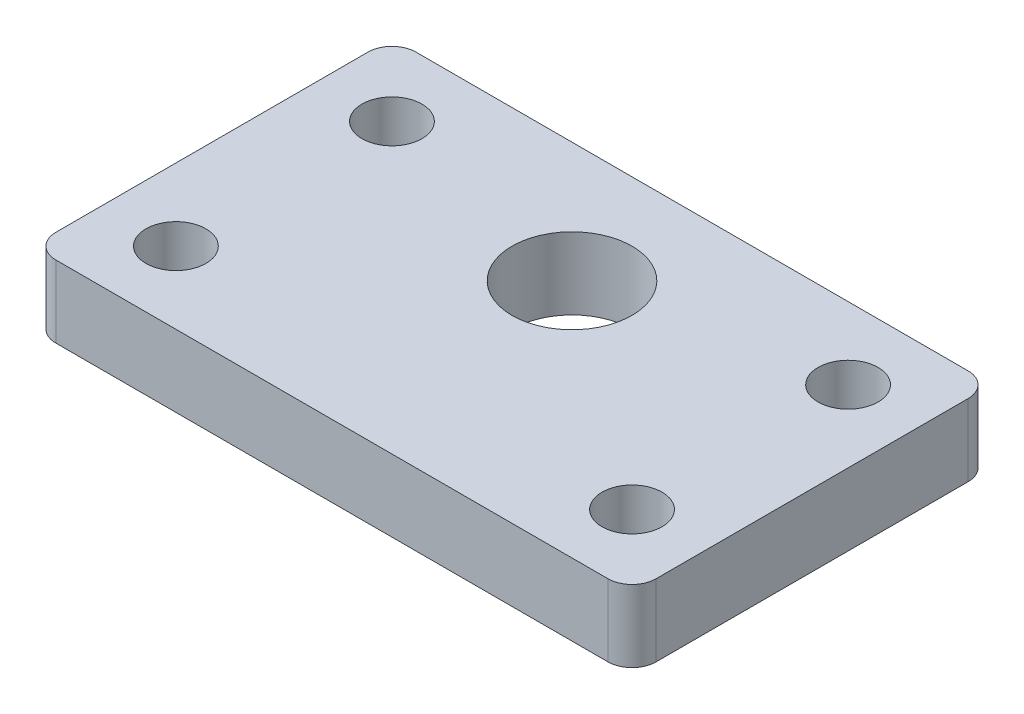
ISO-10303-21;
HEADER;
FILE_DESCRIPTION(('STEP AP214'),'2;1');
FILE_NAME('part.step','',(''),(''),'','','');
FILE_SCHEMA(('AUTOMOTIVE_DESIGN { 1 0 10303 214 1 1 1 1 }'));
ENDSEC;
DATA;
#1=APPLICATION_CONTEXT('core data for automotive mechanical design processes');
#2=APPLICATION_PROTOCOL_DEFINITION('international standard','automotive_design',2000,#1);
#3=PRODUCT_CONTEXT('',#1,'mechanical');
#4=PRODUCT('Part','Part','',(#3));
#5=PRODUCT_RELATED_PRODUCT_CATEGORY('part','',(#4));
#6=PRODUCT_DEFINITION_FORMATION('','',#4);
#7=PRODUCT_DEFINITION_CONTEXT('part definition',#1,'design');
#8=PRODUCT_DEFINITION('design','',#6,#7);
#9=PRODUCT_DEFINITION_SHAPE('','',#8);
#10=(LENGTH_UNIT() NAMED_UNIT(*) SI_UNIT(.MILLI.,.METRE.));
#11=(NAMED_UNIT(*) PLANE_ANGLE_UNIT() SI_UNIT($,.RADIAN.));
#12=(NAMED_UNIT(*) SI_UNIT($,.STERADIAN.) SOLID_ANGLE_UNIT());
#13=UNCERTAINTY_MEASURE_WITH_UNIT(LENGTH_MEASURE(1.E-05),#10,'distance_accuracy_value','');
#14=(GEOMETRIC_REPRESENTATION_CONTEXT(3) GLOBAL_UNCERTAINTY_ASSIGNED_CONTEXT((#13)) GLOBAL_UNIT_ASSIGNED_CONTEXT((#10,
#11,#12)) REPRESENTATION_CONTEXT('',''));
#15=CARTESIAN_POINT('',(0.,0.,0.));
#16=DIRECTION('',(0.,0.,1.));
#17=DIRECTION('',(1.,0.,0.));
#18=AXIS2_PLACEMENT_3D('',#15,#16,#17);
#19=CARTESIAN_POINT('',(115.,30.,-65.));
#20=DIRECTION('',(0.,-1.,0.));
#21=DIRECTION('',(0.,0.,-1.));
#22=AXIS2_PLACEMENT_3D('',#19,#20,#21);
#23=CYLINDRICAL_SURFACE('',#22,9.99999999999999);
#24=CARTESIAN_POINT('',(115.,0.,-65.));
#25=DIRECTION('',(0.,1.,0.));
#26=DIRECTION('',(0.,0.,-1.));
#27=AXIS2_PLACEMENT_3D('',#24,#25,#26);
#28=CIRCLE('',#27,9.99999999999999);
#29=CARTESIAN_POINT('',(125.,0.,-64.9999999999999));
#30=VERTEX_POINT('',#29);
#31=CARTESIAN_POINT('',(115.,0.,-75.));
#32=VERTEX_POINT('',#31);
#33=EDGE_CURVE('E146',#30,#32,#28,.T.);
#34=ORIENTED_EDGE('',*,*,#33,.T.);
#35=DIRECTION('',(0.,-1.,0.));
#36=VECTOR('',#35,1.);
#37=CARTESIAN_POINT('',(115.,30.,-75.));
#38=LINE('',#37,#36);
#39=CARTESIAN_POINT('',(115.,30.,-75.));
#40=VERTEX_POINT('',#39);
#41=EDGE_CURVE('E11',#40,#32,#38,.T.);
#42=ORIENTED_EDGE('',*,*,#41,.F.);
#43=CARTESIAN_POINT('',(115.,30.,-65.));
#44=DIRECTION('',(0.,1.,0.));
#45=DIRECTION('',(0.,0.,-1.));
#46=AXIS2_PLACEMENT_3D('',#43,#44,#45);
#47=CIRCLE('',#46,9.99999999999999);
#48=CARTESIAN_POINT('',(125.,30.,-64.9999999999999));
#49=VERTEX_POINT('',#48);
#50=EDGE_CURVE('E169',#49,#40,#47,.T.);
#51=ORIENTED_EDGE('',*,*,#50,.F.);
#52=DIRECTION('',(0.,-1.,0.));
#53=VECTOR('',#52,1.);
#54=CARTESIAN_POINT('',(125.,30.,-64.9999999999999));
#55=LINE('',#54,#53);
#56=EDGE_CURVE('E142',#49,#30,#55,.T.);
#57=ORIENTED_EDGE('',*,*,#56,.T.);
#58=EDGE_LOOP('',(#34,#42,#51,#57));
#59=FACE_BOUND('',#58,.T.);
#60=ADVANCED_FACE('F45',(#59),#23,.T.);
#61=CARTESIAN_POINT('',(-115.,30.,-75.));
#62=DIRECTION('',(0.,0.,1.));
#63=DIRECTION('',(1.,0.,0.));
#64=AXIS2_PLACEMENT_3D('',#61,#62,#63);
#65=PLANE('',#64);
#66=DIRECTION('',(-1.,0.,0.));
#67=VECTOR('',#66,1.);
#68=CARTESIAN_POINT('',(-115.,0.,-75.));
#69=LINE('',#68,#67);
#70=CARTESIAN_POINT('',(-115.,0.,-75.));
#71=VERTEX_POINT('',#70);
#72=EDGE_CURVE('E150',#32,#71,#69,.T.);
#73=ORIENTED_EDGE('',*,*,#72,.T.);
#74=DIRECTION('',(0.,-1.,0.));
#75=VECTOR('',#74,1.);
#76=CARTESIAN_POINT('',(-115.,30.,-75.));
#77=LINE('',#76,#75);
#78=CARTESIAN_POINT('',(-115.,30.,-75.));
#79=VERTEX_POINT('',#78);
#80=EDGE_CURVE('E54',#79,#71,#77,.T.);
#81=ORIENTED_EDGE('',*,*,#80,.F.);
#82=DIRECTION('',(-1.,0.,0.));
#83=VECTOR('',#82,1.);
#84=CARTESIAN_POINT('',(-115.,30.,-75.));
#85=LINE('',#84,#83);
#86=EDGE_CURVE('E105',#40,#79,#85,.T.);
#87=ORIENTED_EDGE('',*,*,#86,.F.);
#88=ORIENTED_EDGE('',*,*,#41,.T.);
#89=EDGE_LOOP('',(#73,#81,#87,#88));
#90=FACE_BOUND('',#89,.T.);
#91=ADVANCED_FACE('F278',(#90),#65,.F.);
#92=CARTESIAN_POINT('',(-115.,30.,-65.));
#93=DIRECTION('',(0.,-1.,0.));
#94=DIRECTION('',(0.,0.,-1.));
#95=AXIS2_PLACEMENT_3D('',#92,#93,#94);
#96=CYLINDRICAL_SURFACE('',#95,9.99999999999999);
#97=CARTESIAN_POINT('',(-115.,0.,-65.));
#98=DIRECTION('',(0.,1.,0.));
#99=DIRECTION('',(0.,0.,1.));
#100=AXIS2_PLACEMENT_3D('',#97,#98,#99);
#101=CIRCLE('',#100,9.99999999999999);
#102=CARTESIAN_POINT('',(-125.,0.,-64.9999999999999));
#103=VERTEX_POINT('',#102);
#104=EDGE_CURVE('E154',#71,#103,#101,.T.);
#105=ORIENTED_EDGE('',*,*,#104,.T.);
#106=DIRECTION('',(0.,-1.,0.));
#107=VECTOR('',#106,1.);
#108=CARTESIAN_POINT('',(-125.,30.,-64.9999999999999));
#109=LINE('',#108,#107);
#110=CARTESIAN_POINT('',(-125.,30.,-64.9999999999999));
#111=VERTEX_POINT('',#110);
#112=EDGE_CURVE('E180',#111,#103,#109,.T.);
#113=ORIENTED_EDGE('',*,*,#112,.F.);
#114=CARTESIAN_POINT('',(-115.,30.,-65.));
#115=DIRECTION('',(0.,1.,0.));
#116=DIRECTION('',(0.,0.,1.));
#117=AXIS2_PLACEMENT_3D('',#114,#115,#116);
#118=CIRCLE('',#117,9.99999999999999);
#119=EDGE_CURVE('E190',#79,#111,#118,.T.);
#120=ORIENTED_EDGE('',*,*,#119,.F.);
#121=ORIENTED_EDGE('',*,*,#80,.T.);
#122=EDGE_LOOP('',(#105,#113,#120,#121));
#123=FACE_BOUND('',#122,.T.);
#124=ADVANCED_FACE('F188',(#123),#96,.T.);
#125=CARTESIAN_POINT('',(-125.,30.,-64.9999999999999));
#126=DIRECTION('',(1.,0.,0.));
#127=DIRECTION('',(0.,0.,-1.));
#128=AXIS2_PLACEMENT_3D('',#125,#126,#127);
#129=PLANE('',#128);
#130=DIRECTION('',(0.,0.,1.));
#131=VECTOR('',#130,1.);
#132=CARTESIAN_POINT('',(-125.,0.,-64.9999999999999));
#133=LINE('',#132,#131);
#134=CARTESIAN_POINT('',(-125.,0.,64.9999999999999));
#135=VERTEX_POINT('',#134);
#136=EDGE_CURVE('E157',#103,#135,#133,.T.);
#137=ORIENTED_EDGE('',*,*,#136,.T.);
#138=DIRECTION('',(0.,-1.,0.));
#139=VECTOR('',#138,1.);
#140=CARTESIAN_POINT('',(-125.,30.,64.9999999999999));
#141=LINE('',#140,#139);
#142=CARTESIAN_POINT('',(-125.,30.,64.9999999999999));
#143=VERTEX_POINT('',#142);
#144=EDGE_CURVE('E176',#143,#135,#141,.T.);
#145=ORIENTED_EDGE('',*,*,#144,.F.);
#146=DIRECTION('',(0.,0.,1.));
#147=VECTOR('',#146,1.);
#148=CARTESIAN_POINT('',(-125.,30.,-64.9999999999999));
#149=LINE('',#148,#147);
#150=EDGE_CURVE('E203',#111,#143,#149,.T.);
#151=ORIENTED_EDGE('',*,*,#150,.F.);
#152=ORIENTED_EDGE('',*,*,#112,.T.);
#153=EDGE_LOOP('',(#137,#145,#151,#152));
#154=FACE_BOUND('',#153,.T.);
#155=ADVANCED_FACE('F198',(#154),#129,.F.);
#156=CARTESIAN_POINT('',(-115.,30.,65.));
#157=DIRECTION('',(0.,-1.,0.));
#158=DIRECTION('',(0.,0.,-1.));
#159=AXIS2_PLACEMENT_3D('',#156,#157,#158);
#160=CYLINDRICAL_SURFACE('',#159,9.99999999999999);
#161=CARTESIAN_POINT('',(-115.,0.,65.));
#162=DIRECTION('',(0.,1.,0.));
#163=DIRECTION('',(0.,0.,1.));
#164=AXIS2_PLACEMENT_3D('',#161,#162,#163);
#165=CIRCLE('',#164,9.99999999999999);
#166=CARTESIAN_POINT('',(-115.,0.,75.));
#167=VERTEX_POINT('',#166);
#168=EDGE_CURVE('E160',#135,#167,#165,.T.);
#169=ORIENTED_EDGE('',*,*,#168,.T.);
#170=DIRECTION('',(0.,-1.,0.));
#171=VECTOR('',#170,1.);
#172=CARTESIAN_POINT('',(-115.,30.,75.));
#173=LINE('',#172,#171);
#174=CARTESIAN_POINT('',(-115.,30.,75.));
#175=VERTEX_POINT('',#174);
#176=EDGE_CURVE('E135',#175,#167,#173,.T.);
#177=ORIENTED_EDGE('',*,*,#176,.F.);
#178=CARTESIAN_POINT('',(-115.,30.,65.));
#179=DIRECTION('',(0.,1.,0.));
#180=DIRECTION('',(0.,0.,1.));
#181=AXIS2_PLACEMENT_3D('',#178,#179,#180);
#182=CIRCLE('',#181,9.99999999999999);
#183=EDGE_CURVE('E124',#143,#175,#182,.T.);
#184=ORIENTED_EDGE('',*,*,#183,.F.);
#185=ORIENTED_EDGE('',*,*,#144,.T.);
#186=EDGE_LOOP('',(#169,#177,#184,#185));
#187=FACE_BOUND('',#186,.T.);
#188=ADVANCED_FACE('F201',(#187),#160,.T.);
#189=CARTESIAN_POINT('',(-115.,30.,75.));
#190=DIRECTION('',(0.,0.,-1.));
#191=DIRECTION('',(-1.,0.,0.));
#192=AXIS2_PLACEMENT_3D('',#189,#190,#191);
#193=PLANE('',#192);
#194=DIRECTION('',(1.,0.,0.));
#195=VECTOR('',#194,1.);
#196=CARTESIAN_POINT('',(-115.,0.,75.));
#197=LINE('',#196,#195);
#198=CARTESIAN_POINT('',(115.,0.,75.));
#199=VERTEX_POINT('',#198);
#200=EDGE_CURVE('E133',#167,#199,#197,.T.);
#201=ORIENTED_EDGE('',*,*,#200,.T.);
#202=DIRECTION('',(0.,-1.,0.));
#203=VECTOR('',#202,1.);
#204=CARTESIAN_POINT('',(115.,30.,75.));
#205=LINE('',#204,#203);
#206=CARTESIAN_POINT('',(115.,30.,75.));
#207=VERTEX_POINT('',#206);
#208=EDGE_CURVE('E130',#207,#199,#205,.T.);
#209=ORIENTED_EDGE('',*,*,#208,.F.);
#210=DIRECTION('',(1.,0.,0.));
#211=VECTOR('',#210,1.);
#212=CARTESIAN_POINT('',(-115.,30.,75.));
#213=LINE('',#212,#211);
#214=EDGE_CURVE('E118',#175,#207,#213,.T.);
#215=ORIENTED_EDGE('',*,*,#214,.F.);
#216=ORIENTED_EDGE('',*,*,#176,.T.);
#217=EDGE_LOOP('',(#201,#209,#215,#216));
#218=FACE_BOUND('',#217,.T.);
#219=ADVANCED_FACE('F131',(#218),#193,.F.);
#220=CARTESIAN_POINT('',(115.,30.,65.));
#221=DIRECTION('',(0.,-1.,0.));
#222=DIRECTION('',(0.,0.,-1.));
#223=AXIS2_PLACEMENT_3D('',#220,#221,#222);
#224=CYLINDRICAL_SURFACE('',#223,10.);
#225=CARTESIAN_POINT('',(115.,0.,65.));
#226=DIRECTION('',(0.,1.,0.));
#227=DIRECTION('',(0.,0.,1.));
#228=AXIS2_PLACEMENT_3D('',#225,#226,#227);
#229=CIRCLE('',#228,10.);
#230=CARTESIAN_POINT('',(125.,0.,64.9999999999999));
#231=VERTEX_POINT('',#230);
#232=EDGE_CURVE('E91',#199,#231,#229,.T.);
#233=ORIENTED_EDGE('',*,*,#232,.T.);
#234=DIRECTION('',(0.,-1.,0.));
#235=VECTOR('',#234,1.);
#236=CARTESIAN_POINT('',(125.,30.,64.9999999999999));
#237=LINE('',#236,#235);
#238=CARTESIAN_POINT('',(125.,30.,64.9999999999999));
#239=VERTEX_POINT('',#238);
#240=EDGE_CURVE('E136',#239,#231,#237,.T.);
#241=ORIENTED_EDGE('',*,*,#240,.F.);
#242=CARTESIAN_POINT('',(115.,30.,65.));
#243=DIRECTION('',(0.,1.,0.));
#244=DIRECTION('',(0.,0.,1.));
#245=AXIS2_PLACEMENT_3D('',#242,#243,#244);
#246=CIRCLE('',#245,10.);
#247=EDGE_CURVE('E122',#207,#239,#246,.T.);
#248=ORIENTED_EDGE('',*,*,#247,.F.);
#249=ORIENTED_EDGE('',*,*,#208,.T.);
#250=EDGE_LOOP('',(#233,#241,#248,#249));
#251=FACE_BOUND('',#250,.T.);
#252=ADVANCED_FACE('F138',(#251),#224,.T.);
#253=CARTESIAN_POINT('',(125.,30.,-64.9999999999999));
#254=DIRECTION('',(-1.,0.,0.));
#255=DIRECTION('',(0.,0.,1.));
#256=AXIS2_PLACEMENT_3D('',#253,#254,#255);
#257=PLANE('',#256);
#258=DIRECTION('',(0.,0.,-1.));
#259=VECTOR('',#258,1.);
#260=CARTESIAN_POINT('',(125.,0.,-64.9999999999999));
#261=LINE('',#260,#259);
#262=EDGE_CURVE('E97',#231,#30,#261,.T.);
#263=ORIENTED_EDGE('',*,*,#262,.T.);
#264=ORIENTED_EDGE('',*,*,#56,.F.);
#265=DIRECTION('',(0.,0.,-1.));
#266=VECTOR('',#265,1.);
#267=CARTESIAN_POINT('',(125.,30.,-64.9999999999999));
#268=LINE('',#267,#266);
#269=EDGE_CURVE('E62',#239,#49,#268,.T.);
#270=ORIENTED_EDGE('',*,*,#269,.F.);
#271=ORIENTED_EDGE('',*,*,#240,.T.);
#272=EDGE_LOOP('',(#263,#264,#270,#271));
#273=FACE_BOUND('',#272,.T.);
#274=ADVANCED_FACE('F257',(#273),#257,.F.);
#275=CARTESIAN_POINT('',(115.,30.,-65.));
#276=DIRECTION('',(0.,-1.,0.));
#277=DIRECTION('',(0.,0.,-1.));
#278=AXIS2_PLACEMENT_3D('',#275,#276,#277);
#279=PLANE('',#278);
#280=CARTESIAN_POINT('',(-95.,30.,45.));
#281=DIRECTION('',(0.,1.,0.));
#282=DIRECTION('',(0.,0.,1.));
#283=AXIS2_PLACEMENT_3D('',#280,#281,#282);
#284=CIRCLE('',#283,12.5);
#285=CARTESIAN_POINT('',(-95.,30.,57.5));
#286=VERTEX_POINT('',#285);
#287=EDGE_CURVE('E225',#286,#286,#284,.T.);
#288=ORIENTED_EDGE('',*,*,#287,.F.);
#289=EDGE_LOOP('',(#288));
#290=FACE_BOUND('',#289,.T.);
#291=CARTESIAN_POINT('',(95.,30.,45.));
#292=DIRECTION('',(0.,1.,0.));
#293=DIRECTION('',(0.,0.,1.));
#294=AXIS2_PLACEMENT_3D('',#291,#292,#293);
#295=CIRCLE('',#294,12.5);
#296=CARTESIAN_POINT('',(95.,30.,57.5));
#297=VERTEX_POINT('',#296);
#298=EDGE_CURVE('E233',#297,#297,#295,.T.);
#299=ORIENTED_EDGE('',*,*,#298,.F.);
#300=EDGE_LOOP('',(#299));
#301=FACE_BOUND('',#300,.T.);
#302=CARTESIAN_POINT('',(95.,30.,-45.));
#303=DIRECTION('',(0.,1.,0.));
#304=DIRECTION('',(0.,0.,1.));
#305=AXIS2_PLACEMENT_3D('',#302,#303,#304);
#306=CIRCLE('',#305,12.5);
#307=CARTESIAN_POINT('',(95.,30.,-32.5));
#308=VERTEX_POINT('',#307);
#309=EDGE_CURVE('E241',#308,#308,#306,.T.);
#310=ORIENTED_EDGE('',*,*,#309,.F.);
#311=EDGE_LOOP('',(#310));
#312=FACE_BOUND('',#311,.T.);
#313=CARTESIAN_POINT('',(-95.,30.,-45.));
#314=DIRECTION('',(0.,1.,0.));
#315=DIRECTION('',(0.,0.,1.));
#316=AXIS2_PLACEMENT_3D('',#313,#314,#315);
#317=CIRCLE('',#316,12.5);
#318=CARTESIAN_POINT('',(-95.,30.,-32.5));
#319=VERTEX_POINT('',#318);
#320=EDGE_CURVE('E217',#319,#319,#317,.T.);
#321=ORIENTED_EDGE('',*,*,#320,.F.);
#322=EDGE_LOOP('',(#321));
#323=FACE_BOUND('',#322,.T.);
#324=CARTESIAN_POINT('',(0.,30.,-25.));
#325=DIRECTION('',(0.,1.,0.));
#326=DIRECTION('',(0.,0.,1.));
#327=AXIS2_PLACEMENT_3D('',#324,#325,#326);
#328=CIRCLE('',#327,25.);
#329=CARTESIAN_POINT('',(0.,30.,0.));
#330=VERTEX_POINT('',#329);
#331=EDGE_CURVE('E213',#330,#330,#328,.T.);
#332=ORIENTED_EDGE('',*,*,#331,.F.);
#333=EDGE_LOOP('',(#332));
#334=FACE_BOUND('',#333,.T.);
#335=ORIENTED_EDGE('',*,*,#50,.T.);
#336=ORIENTED_EDGE('',*,*,#86,.T.);
#337=ORIENTED_EDGE('',*,*,#119,.T.);
#338=ORIENTED_EDGE('',*,*,#150,.T.);
#339=ORIENTED_EDGE('',*,*,#183,.T.);
#340=ORIENTED_EDGE('',*,*,#214,.T.);
#341=ORIENTED_EDGE('',*,*,#247,.T.);
#342=ORIENTED_EDGE('',*,*,#269,.T.);
#343=EDGE_LOOP('',(#335,#336,#337,#338,#339,#340,#341,#342));
#344=FACE_BOUND('',#343,.T.);
#345=ADVANCED_FACE('F120',(#290,#301,#312,#323,#334,#344),#279,.F.);
#346=CARTESIAN_POINT('',(115.,0.,-65.));
#347=DIRECTION('',(0.,-1.,0.));
#348=DIRECTION('',(0.,0.,-1.));
#349=AXIS2_PLACEMENT_3D('',#346,#347,#348);
#350=PLANE('',#349);
#351=CARTESIAN_POINT('',(-95.,0.,45.));
#352=DIRECTION('',(0.,1.,0.));
#353=DIRECTION('',(0.,0.,1.));
#354=AXIS2_PLACEMENT_3D('',#351,#352,#353);
#355=CIRCLE('',#354,12.5);
#356=CARTESIAN_POINT('',(-95.,0.,57.5));
#357=VERTEX_POINT('',#356);
#358=EDGE_CURVE('E221',#357,#357,#355,.T.);
#359=ORIENTED_EDGE('',*,*,#358,.T.);
#360=EDGE_LOOP('',(#359));
#361=FACE_BOUND('',#360,.T.);
#362=CARTESIAN_POINT('',(95.,0.,45.));
#363=DIRECTION('',(0.,1.,0.));
#364=DIRECTION('',(0.,0.,1.));
#365=AXIS2_PLACEMENT_3D('',#362,#363,#364);
#366=CIRCLE('',#365,12.5);
#367=CARTESIAN_POINT('',(95.,0.,57.5));
#368=VERTEX_POINT('',#367);
#369=EDGE_CURVE('E229',#368,#368,#366,.T.);
#370=ORIENTED_EDGE('',*,*,#369,.T.);
#371=EDGE_LOOP('',(#370));
#372=FACE_BOUND('',#371,.T.);
#373=CARTESIAN_POINT('',(95.,0.,-45.));
#374=DIRECTION('',(0.,1.,0.));
#375=DIRECTION('',(0.,0.,1.));
#376=AXIS2_PLACEMENT_3D('',#373,#374,#375);
#377=CIRCLE('',#376,12.5);
#378=CARTESIAN_POINT('',(95.,0.,-32.5));
#379=VERTEX_POINT('',#378);
#380=EDGE_CURVE('E237',#379,#379,#377,.T.);
#381=ORIENTED_EDGE('',*,*,#380,.T.);
#382=EDGE_LOOP('',(#381));
#383=FACE_BOUND('',#382,.T.);
#384=CARTESIAN_POINT('',(-95.,0.,-45.));
#385=DIRECTION('',(0.,1.,0.));
#386=DIRECTION('',(0.,0.,1.));
#387=AXIS2_PLACEMENT_3D('',#384,#385,#386);
#388=CIRCLE('',#387,12.5);
#389=CARTESIAN_POINT('',(-95.,0.,-32.5));
#390=VERTEX_POINT('',#389);
#391=EDGE_CURVE('E245',#390,#390,#388,.T.);
#392=ORIENTED_EDGE('',*,*,#391,.T.);
#393=EDGE_LOOP('',(#392));
#394=FACE_BOUND('',#393,.T.);
#395=CARTESIAN_POINT('',(0.,0.,-25.));
#396=DIRECTION('',(0.,1.,0.));
#397=DIRECTION('',(0.,0.,1.));
#398=AXIS2_PLACEMENT_3D('',#395,#396,#397);
#399=CIRCLE('',#398,25.);
#400=CARTESIAN_POINT('',(0.,0.,0.));
#401=VERTEX_POINT('',#400);
#402=EDGE_CURVE('E151',#401,#401,#399,.T.);
#403=ORIENTED_EDGE('',*,*,#402,.T.);
#404=EDGE_LOOP('',(#403));
#405=FACE_BOUND('',#404,.T.);
#406=ORIENTED_EDGE('',*,*,#33,.F.);
#407=ORIENTED_EDGE('',*,*,#262,.F.);
#408=ORIENTED_EDGE('',*,*,#232,.F.);
#409=ORIENTED_EDGE('',*,*,#200,.F.);
#410=ORIENTED_EDGE('',*,*,#168,.F.);
#411=ORIENTED_EDGE('',*,*,#136,.F.);
#412=ORIENTED_EDGE('',*,*,#104,.F.);
#413=ORIENTED_EDGE('',*,*,#72,.F.);
#414=EDGE_LOOP('',(#406,#407,#408,#409,#410,#411,#412,#413));
#415=FACE_BOUND('',#414,.T.);
#416=ADVANCED_FACE('F194',(#361,#372,#383,#394,#405,#415),#350,.T.);
#417=CARTESIAN_POINT('',(0.,0.,-25.));
#418=DIRECTION('',(0.,1.,0.));
#419=DIRECTION('',(0.,0.,1.));
#420=AXIS2_PLACEMENT_3D('',#417,#418,#419);
#421=CYLINDRICAL_SURFACE('',#420,25.);
#422=ORIENTED_EDGE('',*,*,#402,.F.);
#423=EDGE_LOOP('',(#422));
#424=FACE_BOUND('',#423,.T.);
#425=ORIENTED_EDGE('',*,*,#331,.T.);
#426=EDGE_LOOP('',(#425));
#427=FACE_BOUND('',#426,.T.);
#428=ADVANCED_FACE('F262',(#424,#427),#421,.F.);
#429=CARTESIAN_POINT('',(-95.,0.,-45.));
#430=DIRECTION('',(0.,1.,0.));
#431=DIRECTION('',(0.,0.,1.));
#432=AXIS2_PLACEMENT_3D('',#429,#430,#431);
#433=CYLINDRICAL_SURFACE('',#432,12.5);
#434=ORIENTED_EDGE('',*,*,#391,.F.);
#435=EDGE_LOOP('',(#434));
#436=FACE_BOUND('',#435,.T.);
#437=ORIENTED_EDGE('',*,*,#320,.T.);
#438=EDGE_LOOP('',(#437));
#439=FACE_BOUND('',#438,.T.);
#440=ADVANCED_FACE('F253',(#436,#439),#433,.F.);
#441=CARTESIAN_POINT('',(95.,0.,-45.));
#442=DIRECTION('',(0.,1.,0.));
#443=DIRECTION('',(0.,0.,1.));
#444=AXIS2_PLACEMENT_3D('',#441,#442,#443);
#445=CYLINDRICAL_SURFACE('',#444,12.5);
#446=ORIENTED_EDGE('',*,*,#380,.F.);
#447=EDGE_LOOP('',(#446));
#448=FACE_BOUND('',#447,.T.);
#449=ORIENTED_EDGE('',*,*,#309,.T.);
#450=EDGE_LOOP('',(#449));
#451=FACE_BOUND('',#450,.T.);
#452=ADVANCED_FACE('F270',(#448,#451),#445,.F.);
#453=CARTESIAN_POINT('',(95.,0.,45.));
#454=DIRECTION('',(0.,1.,0.));
#455=DIRECTION('',(0.,0.,1.));
#456=AXIS2_PLACEMENT_3D('',#453,#454,#455);
#457=CYLINDRICAL_SURFACE('',#456,12.5);
#458=ORIENTED_EDGE('',*,*,#369,.F.);
#459=EDGE_LOOP('',(#458));
#460=FACE_BOUND('',#459,.T.);
#461=ORIENTED_EDGE('',*,*,#298,.T.);
#462=EDGE_LOOP('',(#461));
#463=FACE_BOUND('',#462,.T.);
#464=ADVANCED_FACE('F359',(#460,#463),#457,.F.);
#465=CARTESIAN_POINT('',(-95.,0.,45.));
#466=DIRECTION('',(0.,1.,0.));
#467=DIRECTION('',(0.,0.,1.));
#468=AXIS2_PLACEMENT_3D('',#465,#466,#467);
#469=CYLINDRICAL_SURFACE('',#468,12.5);
#470=ORIENTED_EDGE('',*,*,#358,.F.);
#471=EDGE_LOOP('',(#470));
#472=FACE_BOUND('',#471,.T.);
#473=ORIENTED_EDGE('',*,*,#287,.T.);
#474=EDGE_LOOP('',(#473));
#475=FACE_BOUND('',#474,.T.);
#476=ADVANCED_FACE('F369',(#472,#475),#469,.F.);
#477=CLOSED_SHELL('',(#60,#91,#124,#155,#188,#219,#252,#274,#345,#416,#428,#440,#452,#464,#476));
#478=MANIFOLD_SOLID_BREP('B2',#477);
#479=ADVANCED_BREP_SHAPE_REPRESENTATION('',(#18,#478),#14);
#480=SHAPE_DEFINITION_REPRESENTATION(#9,#479);
ENDSEC;
END-ISO-10303-21;
